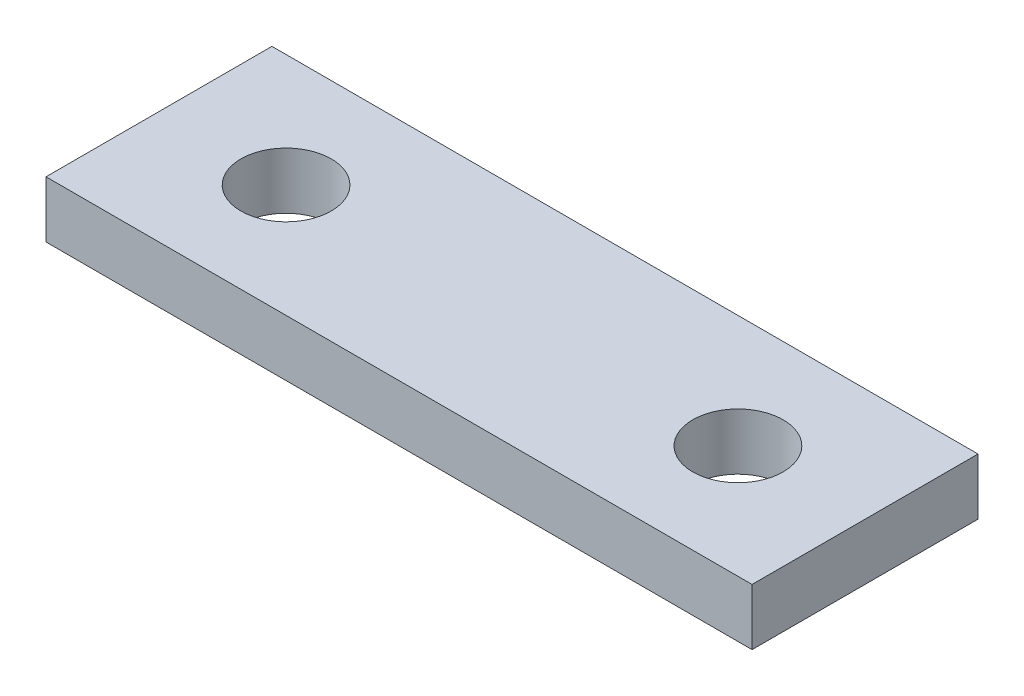
ISO-10303-21;
HEADER;
FILE_DESCRIPTION(('STEP AP214'),'2;1');
FILE_NAME('part.step','',(''),(''),'','','');
FILE_SCHEMA(('AUTOMOTIVE_DESIGN { 1 0 10303 214 1 1 1 1 }'));
ENDSEC;
DATA;
#1=APPLICATION_CONTEXT('core data for automotive mechanical design processes');
#2=APPLICATION_PROTOCOL_DEFINITION('international standard','automotive_design',2000,#1);
#3=PRODUCT_CONTEXT('',#1,'mechanical');
#4=PRODUCT('Part','Part','',(#3));
#5=PRODUCT_RELATED_PRODUCT_CATEGORY('part','',(#4));
#6=PRODUCT_DEFINITION_FORMATION('','',#4);
#7=PRODUCT_DEFINITION_CONTEXT('part definition',#1,'design');
#8=PRODUCT_DEFINITION('design','',#6,#7);
#9=PRODUCT_DEFINITION_SHAPE('','',#8);
#10=(LENGTH_UNIT() NAMED_UNIT(*) SI_UNIT(.MILLI.,.METRE.));
#11=(NAMED_UNIT(*) PLANE_ANGLE_UNIT() SI_UNIT($,.RADIAN.));
#12=(NAMED_UNIT(*) SI_UNIT($,.STERADIAN.) SOLID_ANGLE_UNIT());
#13=UNCERTAINTY_MEASURE_WITH_UNIT(LENGTH_MEASURE(1.E-05),#10,'distance_accuracy_value','');
#14=(GEOMETRIC_REPRESENTATION_CONTEXT(3) GLOBAL_UNCERTAINTY_ASSIGNED_CONTEXT((#13)) GLOBAL_UNIT_ASSIGNED_CONTEXT((#10,
#11,#12)) REPRESENTATION_CONTEXT('',''));
#15=CARTESIAN_POINT('',(0.,0.,0.));
#16=DIRECTION('',(0.,0.,1.));
#17=DIRECTION('',(1.,0.,0.));
#18=AXIS2_PLACEMENT_3D('',#15,#16,#17);
#19=CARTESIAN_POINT('',(0.,10.,0.));
#20=DIRECTION('',(0.,-1.,0.));
#21=DIRECTION('',(0.,0.,-1.));
#22=AXIS2_PLACEMENT_3D('',#19,#20,#21);
#23=PLANE('',#22);
#24=DIRECTION('',(0.,0.,1.));
#25=VECTOR('',#24,1.);
#26=CARTESIAN_POINT('',(0.,10.,0.));
#27=LINE('',#26,#25);
#28=CARTESIAN_POINT('',(0.,10.,-40.));
#29=VERTEX_POINT('',#28);
#30=CARTESIAN_POINT('',(0.,10.,0.));
#31=VERTEX_POINT('',#30);
#32=EDGE_CURVE('E92',#29,#31,#27,.T.);
#33=ORIENTED_EDGE('',*,*,#32,.T.);
#34=DIRECTION('',(1.,0.,0.));
#35=VECTOR('',#34,1.);
#36=CARTESIAN_POINT('',(0.,10.,0.));
#37=LINE('',#36,#35);
#38=CARTESIAN_POINT('',(125.,10.,0.));
#39=VERTEX_POINT('',#38);
#40=EDGE_CURVE('E87',#31,#39,#37,.T.);
#41=ORIENTED_EDGE('',*,*,#40,.T.);
#42=DIRECTION('',(0.,0.,-1.));
#43=VECTOR('',#42,1.);
#44=CARTESIAN_POINT('',(125.,10.,0.));
#45=LINE('',#44,#43);
#46=CARTESIAN_POINT('',(125.,10.,-40.));
#47=VERTEX_POINT('',#46);
#48=EDGE_CURVE('E90',#39,#47,#45,.T.);
#49=ORIENTED_EDGE('',*,*,#48,.T.);
#50=DIRECTION('',(-1.,0.,0.));
#51=VECTOR('',#50,1.);
#52=CARTESIAN_POINT('',(0.,10.,-40.));
#53=LINE('',#52,#51);
#54=EDGE_CURVE('E57',#47,#29,#53,.T.);
#55=ORIENTED_EDGE('',*,*,#54,.T.);
#56=EDGE_LOOP('',(#33,#41,#49,#55));
#57=FACE_BOUND('',#56,.T.);
#58=CARTESIAN_POINT('',(22.5,10.,-20.));
#59=DIRECTION('',(0.,1.,0.));
#60=DIRECTION('',(0.,0.,1.));
#61=AXIS2_PLACEMENT_3D('',#58,#59,#60);
#62=CIRCLE('',#61,8.);
#63=CARTESIAN_POINT('',(22.5,10.,-12.));
#64=VERTEX_POINT('',#63);
#65=EDGE_CURVE('E112',#64,#64,#62,.T.);
#66=ORIENTED_EDGE('',*,*,#65,.F.);
#67=EDGE_LOOP('',(#66));
#68=FACE_BOUND('',#67,.T.);
#69=CARTESIAN_POINT('',(102.5,10.,-20.));
#70=DIRECTION('',(0.,1.,0.));
#71=DIRECTION('',(0.,0.,1.));
#72=AXIS2_PLACEMENT_3D('',#69,#70,#71);
#73=CIRCLE('',#72,8.);
#74=CARTESIAN_POINT('',(102.5,10.,-12.));
#75=VERTEX_POINT('',#74);
#76=EDGE_CURVE('E134',#75,#75,#73,.T.);
#77=ORIENTED_EDGE('',*,*,#76,.F.);
#78=EDGE_LOOP('',(#77));
#79=FACE_BOUND('',#78,.T.);
#80=ADVANCED_FACE('F39',(#57,#68,#79),#23,.F.);
#81=CARTESIAN_POINT('',(0.,0.,0.));
#82=DIRECTION('',(0.,-1.,0.));
#83=DIRECTION('',(0.,0.,-1.));
#84=AXIS2_PLACEMENT_3D('',#81,#82,#83);
#85=PLANE('',#84);
#86=CARTESIAN_POINT('',(22.5,0.,-20.));
#87=DIRECTION('',(0.,1.,0.));
#88=DIRECTION('',(0.,0.,1.));
#89=AXIS2_PLACEMENT_3D('',#86,#87,#88);
#90=CIRCLE('',#89,8.);
#91=CARTESIAN_POINT('',(22.5,0.,-12.));
#92=VERTEX_POINT('',#91);
#93=EDGE_CURVE('E130',#92,#92,#90,.T.);
#94=ORIENTED_EDGE('',*,*,#93,.T.);
#95=EDGE_LOOP('',(#94));
#96=FACE_BOUND('',#95,.T.);
#97=DIRECTION('',(0.,0.,1.));
#98=VECTOR('',#97,1.);
#99=CARTESIAN_POINT('',(0.,0.,0.));
#100=LINE('',#99,#98);
#101=CARTESIAN_POINT('',(0.,0.,-40.));
#102=VERTEX_POINT('',#101);
#103=CARTESIAN_POINT('',(0.,0.,0.));
#104=VERTEX_POINT('',#103);
#105=EDGE_CURVE('E108',#102,#104,#100,.T.);
#106=ORIENTED_EDGE('',*,*,#105,.F.);
#107=DIRECTION('',(-1.,0.,0.));
#108=VECTOR('',#107,1.);
#109=CARTESIAN_POINT('',(0.,0.,-40.));
#110=LINE('',#109,#108);
#111=CARTESIAN_POINT('',(125.,0.,-40.));
#112=VERTEX_POINT('',#111);
#113=EDGE_CURVE('E80',#112,#102,#110,.T.);
#114=ORIENTED_EDGE('',*,*,#113,.F.);
#115=DIRECTION('',(0.,0.,-1.));
#116=VECTOR('',#115,1.);
#117=CARTESIAN_POINT('',(125.,0.,0.));
#118=LINE('',#117,#116);
#119=CARTESIAN_POINT('',(125.,0.,0.));
#120=VERTEX_POINT('',#119);
#121=EDGE_CURVE('E74',#120,#112,#118,.T.);
#122=ORIENTED_EDGE('',*,*,#121,.F.);
#123=DIRECTION('',(1.,0.,0.));
#124=VECTOR('',#123,1.);
#125=CARTESIAN_POINT('',(0.,0.,0.));
#126=LINE('',#125,#124);
#127=EDGE_CURVE('E97',#104,#120,#126,.T.);
#128=ORIENTED_EDGE('',*,*,#127,.F.);
#129=EDGE_LOOP('',(#106,#114,#122,#128));
#130=FACE_BOUND('',#129,.T.);
#131=CARTESIAN_POINT('',(102.5,0.,-20.));
#132=DIRECTION('',(0.,1.,0.));
#133=DIRECTION('',(0.,0.,1.));
#134=AXIS2_PLACEMENT_3D('',#131,#132,#133);
#135=CIRCLE('',#134,8.);
#136=CARTESIAN_POINT('',(102.5,0.,-12.));
#137=VERTEX_POINT('',#136);
#138=EDGE_CURVE('E138',#137,#137,#135,.T.);
#139=ORIENTED_EDGE('',*,*,#138,.T.);
#140=EDGE_LOOP('',(#139));
#141=FACE_BOUND('',#140,.T.);
#142=ADVANCED_FACE('F125',(#96,#130,#141),#85,.T.);
#143=CARTESIAN_POINT('',(0.,10.,0.));
#144=DIRECTION('',(1.,0.,0.));
#145=DIRECTION('',(0.,0.,-1.));
#146=AXIS2_PLACEMENT_3D('',#143,#144,#145);
#147=PLANE('',#146);
#148=ORIENTED_EDGE('',*,*,#105,.T.);
#149=DIRECTION('',(0.,-1.,0.));
#150=VECTOR('',#149,1.);
#151=CARTESIAN_POINT('',(0.,10.,0.));
#152=LINE('',#151,#150);
#153=EDGE_CURVE('E11',#31,#104,#152,.T.);
#154=ORIENTED_EDGE('',*,*,#153,.F.);
#155=ORIENTED_EDGE('',*,*,#32,.F.);
#156=DIRECTION('',(0.,-1.,0.));
#157=VECTOR('',#156,1.);
#158=CARTESIAN_POINT('',(0.,10.,-40.));
#159=LINE('',#158,#157);
#160=EDGE_CURVE('E104',#29,#102,#159,.T.);
#161=ORIENTED_EDGE('',*,*,#160,.T.);
#162=EDGE_LOOP('',(#148,#154,#155,#161));
#163=FACE_BOUND('',#162,.T.);
#164=ADVANCED_FACE('F41',(#163),#147,.F.);
#165=CARTESIAN_POINT('',(0.,10.,0.));
#166=DIRECTION('',(0.,0.,-1.));
#167=DIRECTION('',(-1.,0.,0.));
#168=AXIS2_PLACEMENT_3D('',#165,#166,#167);
#169=PLANE('',#168);
#170=ORIENTED_EDGE('',*,*,#127,.T.);
#171=DIRECTION('',(0.,-1.,0.));
#172=VECTOR('',#171,1.);
#173=CARTESIAN_POINT('',(125.,10.,0.));
#174=LINE('',#173,#172);
#175=EDGE_CURVE('E49',#39,#120,#174,.T.);
#176=ORIENTED_EDGE('',*,*,#175,.F.);
#177=ORIENTED_EDGE('',*,*,#40,.F.);
#178=ORIENTED_EDGE('',*,*,#153,.T.);
#179=EDGE_LOOP('',(#170,#176,#177,#178));
#180=FACE_BOUND('',#179,.T.);
#181=ADVANCED_FACE('F96',(#180),#169,.F.);
#182=CARTESIAN_POINT('',(125.,10.,0.));
#183=DIRECTION('',(-1.,0.,0.));
#184=DIRECTION('',(0.,0.,1.));
#185=AXIS2_PLACEMENT_3D('',#182,#183,#184);
#186=PLANE('',#185);
#187=ORIENTED_EDGE('',*,*,#121,.T.);
#188=DIRECTION('',(0.,-1.,0.));
#189=VECTOR('',#188,1.);
#190=CARTESIAN_POINT('',(125.,10.,-40.));
#191=LINE('',#190,#189);
#192=EDGE_CURVE('E99',#47,#112,#191,.T.);
#193=ORIENTED_EDGE('',*,*,#192,.F.);
#194=ORIENTED_EDGE('',*,*,#48,.F.);
#195=ORIENTED_EDGE('',*,*,#175,.T.);
#196=EDGE_LOOP('',(#187,#193,#194,#195));
#197=FACE_BOUND('',#196,.T.);
#198=ADVANCED_FACE('F100',(#197),#186,.F.);
#199=CARTESIAN_POINT('',(0.,10.,-40.));
#200=DIRECTION('',(0.,0.,1.));
#201=DIRECTION('',(1.,0.,0.));
#202=AXIS2_PLACEMENT_3D('',#199,#200,#201);
#203=PLANE('',#202);
#204=ORIENTED_EDGE('',*,*,#113,.T.);
#205=ORIENTED_EDGE('',*,*,#160,.F.);
#206=ORIENTED_EDGE('',*,*,#54,.F.);
#207=ORIENTED_EDGE('',*,*,#192,.T.);
#208=EDGE_LOOP('',(#204,#205,#206,#207));
#209=FACE_BOUND('',#208,.T.);
#210=ADVANCED_FACE('F122',(#209),#203,.F.);
#211=CARTESIAN_POINT('',(22.5,10.,-20.));
#212=DIRECTION('',(0.,-1.,0.));
#213=DIRECTION('',(0.,0.,-1.));
#214=AXIS2_PLACEMENT_3D('',#211,#212,#213);
#215=CYLINDRICAL_SURFACE('',#214,8.);
#216=ORIENTED_EDGE('',*,*,#65,.T.);
#217=EDGE_LOOP('',(#216));
#218=FACE_BOUND('',#217,.T.);
#219=ORIENTED_EDGE('',*,*,#93,.F.);
#220=EDGE_LOOP('',(#219));
#221=FACE_BOUND('',#220,.T.);
#222=ADVANCED_FACE('F157',(#218,#221),#215,.F.);
#223=CARTESIAN_POINT('',(102.5,10.,-20.));
#224=DIRECTION('',(0.,-1.,0.));
#225=DIRECTION('',(0.,0.,-1.));
#226=AXIS2_PLACEMENT_3D('',#223,#224,#225);
#227=CYLINDRICAL_SURFACE('',#226,8.);
#228=ORIENTED_EDGE('',*,*,#76,.T.);
#229=EDGE_LOOP('',(#228));
#230=FACE_BOUND('',#229,.T.);
#231=ORIENTED_EDGE('',*,*,#138,.F.);
#232=EDGE_LOOP('',(#231));
#233=FACE_BOUND('',#232,.T.);
#234=ADVANCED_FACE('F146',(#230,#233),#227,.F.);
#235=CLOSED_SHELL('',(#80,#142,#164,#181,#198,#210,#222,#234));
#236=MANIFOLD_SOLID_BREP('B2',#235);
#237=ADVANCED_BREP_SHAPE_REPRESENTATION('',(#18,#236),#14);
#238=SHAPE_DEFINITION_REPRESENTATION(#9,#237);
ENDSEC;
END-ISO-10303-21;
